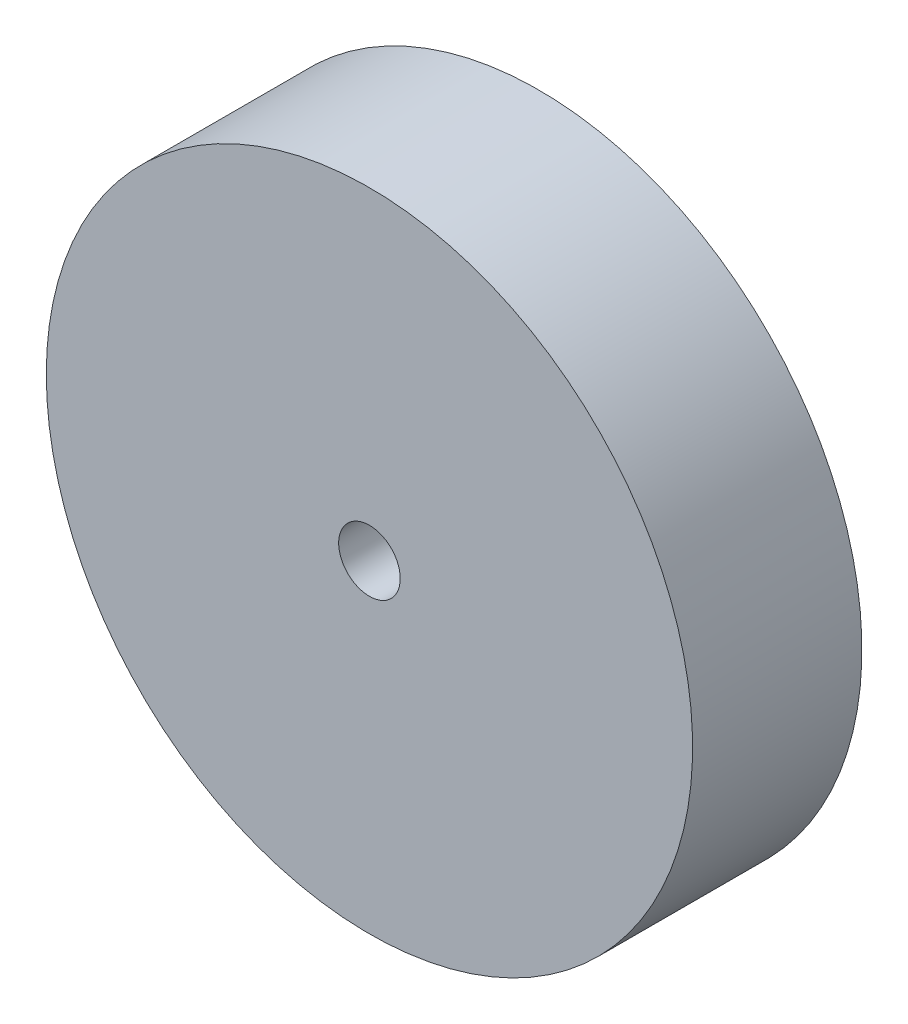
ISO-10303-21;
HEADER;
FILE_DESCRIPTION(('STEP AP214'),'2;1');
FILE_NAME('part.step','',(''),(''),'','','');
FILE_SCHEMA(('AUTOMOTIVE_DESIGN { 1 0 10303 214 1 1 1 1 }'));
ENDSEC;
DATA;
#1=APPLICATION_CONTEXT('core data for automotive mechanical design processes');
#2=APPLICATION_PROTOCOL_DEFINITION('international standard','automotive_design',2000,#1);
#3=PRODUCT_CONTEXT('',#1,'mechanical');
#4=PRODUCT('Part','Part','',(#3));
#5=PRODUCT_RELATED_PRODUCT_CATEGORY('part','',(#4));
#6=PRODUCT_DEFINITION_FORMATION('','',#4);
#7=PRODUCT_DEFINITION_CONTEXT('part definition',#1,'design');
#8=PRODUCT_DEFINITION('design','',#6,#7);
#9=PRODUCT_DEFINITION_SHAPE('','',#8);
#10=(LENGTH_UNIT() NAMED_UNIT(*) SI_UNIT(.MILLI.,.METRE.));
#11=(NAMED_UNIT(*) PLANE_ANGLE_UNIT() SI_UNIT($,.RADIAN.));
#12=(NAMED_UNIT(*) SI_UNIT($,.STERADIAN.) SOLID_ANGLE_UNIT());
#13=UNCERTAINTY_MEASURE_WITH_UNIT(LENGTH_MEASURE(1.E-05),#10,'distance_accuracy_value','');
#14=(GEOMETRIC_REPRESENTATION_CONTEXT(3) GLOBAL_UNCERTAINTY_ASSIGNED_CONTEXT((#13)) GLOBAL_UNIT_ASSIGNED_CONTEXT((#10,
#11,#12)) REPRESENTATION_CONTEXT('',''));
#15=CARTESIAN_POINT('',(0.,0.,0.));
#16=DIRECTION('',(0.,0.,1.));
#17=DIRECTION('',(1.,0.,0.));
#18=AXIS2_PLACEMENT_3D('',#15,#16,#17);
#19=CARTESIAN_POINT('',(0.,0.,25.));
#20=DIRECTION('',(0.,0.,-1.));
#21=DIRECTION('',(-1.,0.,0.));
#22=AXIS2_PLACEMENT_3D('',#19,#20,#21);
#23=CYLINDRICAL_SURFACE('',#22,105.);
#24=CARTESIAN_POINT('',(0.,0.,25.));
#25=DIRECTION('',(0.,0.,-1.));
#26=DIRECTION('',(-1.,0.,0.));
#27=AXIS2_PLACEMENT_3D('',#24,#25,#26);
#28=CIRCLE('',#27,105.);
#29=CARTESIAN_POINT('',(-105.,0.,25.));
#30=VERTEX_POINT('',#29);
#31=EDGE_CURVE('E10',#30,#30,#28,.T.);
#32=ORIENTED_EDGE('',*,*,#31,.T.);
#33=EDGE_LOOP('',(#32));
#34=FACE_BOUND('',#33,.T.);
#35=CARTESIAN_POINT('',(0.,0.,-30.));
#36=DIRECTION('',(0.,0.,-1.));
#37=DIRECTION('',(-1.,0.,0.));
#38=AXIS2_PLACEMENT_3D('',#35,#36,#37);
#39=CIRCLE('',#38,105.);
#40=CARTESIAN_POINT('',(-105.,0.,-30.));
#41=VERTEX_POINT('',#40);
#42=EDGE_CURVE('E44',#41,#41,#39,.T.);
#43=ORIENTED_EDGE('',*,*,#42,.F.);
#44=EDGE_LOOP('',(#43));
#45=FACE_BOUND('',#44,.T.);
#46=ADVANCED_FACE('F36',(#34,#45),#23,.T.);
#47=CARTESIAN_POINT('',(0.,0.,25.));
#48=DIRECTION('',(0.,0.,1.));
#49=DIRECTION('',(1.,0.,0.));
#50=AXIS2_PLACEMENT_3D('',#47,#48,#49);
#51=PLANE('',#50);
#52=CARTESIAN_POINT('',(0.,0.,25.));
#53=DIRECTION('',(0.,0.,1.));
#54=DIRECTION('',(1.,0.,0.));
#55=AXIS2_PLACEMENT_3D('',#52,#53,#54);
#56=CIRCLE('',#55,10.);
#57=CARTESIAN_POINT('',(10.,0.,25.));
#58=VERTEX_POINT('',#57);
#59=EDGE_CURVE('E49',#58,#58,#56,.T.);
#60=ORIENTED_EDGE('',*,*,#59,.F.);
#61=EDGE_LOOP('',(#60));
#62=FACE_BOUND('',#61,.T.);
#63=ORIENTED_EDGE('',*,*,#31,.F.);
#64=EDGE_LOOP('',(#63));
#65=FACE_BOUND('',#64,.T.);
#66=ADVANCED_FACE('F38',(#62,#65),#51,.T.);
#67=CARTESIAN_POINT('',(0.,0.,-30.));
#68=DIRECTION('',(0.,0.,-1.));
#69=DIRECTION('',(-1.,0.,0.));
#70=AXIS2_PLACEMENT_3D('',#67,#68,#69);
#71=PLANE('',#70);
#72=CARTESIAN_POINT('',(0.,0.,-30.));
#73=DIRECTION('',(0.,0.,-1.));
#74=DIRECTION('',(-1.,0.,0.));
#75=AXIS2_PLACEMENT_3D('',#72,#73,#74);
#76=CIRCLE('',#75,10.);
#77=CARTESIAN_POINT('',(-10.,0.,-30.));
#78=VERTEX_POINT('',#77);
#79=EDGE_CURVE('E54',#78,#78,#76,.T.);
#80=ORIENTED_EDGE('',*,*,#79,.F.);
#81=EDGE_LOOP('',(#80));
#82=FACE_BOUND('',#81,.T.);
#83=ORIENTED_EDGE('',*,*,#42,.T.);
#84=EDGE_LOOP('',(#83));
#85=FACE_BOUND('',#84,.T.);
#86=ADVANCED_FACE('F63',(#82,#85),#71,.T.);
#87=CARTESIAN_POINT('',(0.,0.,-115.));
#88=DIRECTION('',(0.,0.,1.));
#89=DIRECTION('',(1.,0.,0.));
#90=AXIS2_PLACEMENT_3D('',#87,#88,#89);
#91=CYLINDRICAL_SURFACE('',#90,10.);
#92=ORIENTED_EDGE('',*,*,#59,.T.);
#93=EDGE_LOOP('',(#92));
#94=FACE_BOUND('',#93,.T.);
#95=ORIENTED_EDGE('',*,*,#79,.T.);
#96=EDGE_LOOP('',(#95));
#97=FACE_BOUND('',#96,.T.);
#98=ADVANCED_FACE('F61',(#94,#97),#91,.F.);
#99=CLOSED_SHELL('',(#46,#66,#86,#98));
#100=MANIFOLD_SOLID_BREP('B2',#99);
#101=ADVANCED_BREP_SHAPE_REPRESENTATION('',(#18,#100),#14);
#102=SHAPE_DEFINITION_REPRESENTATION(#9,#101);
ENDSEC;
END-ISO-10303-21;
